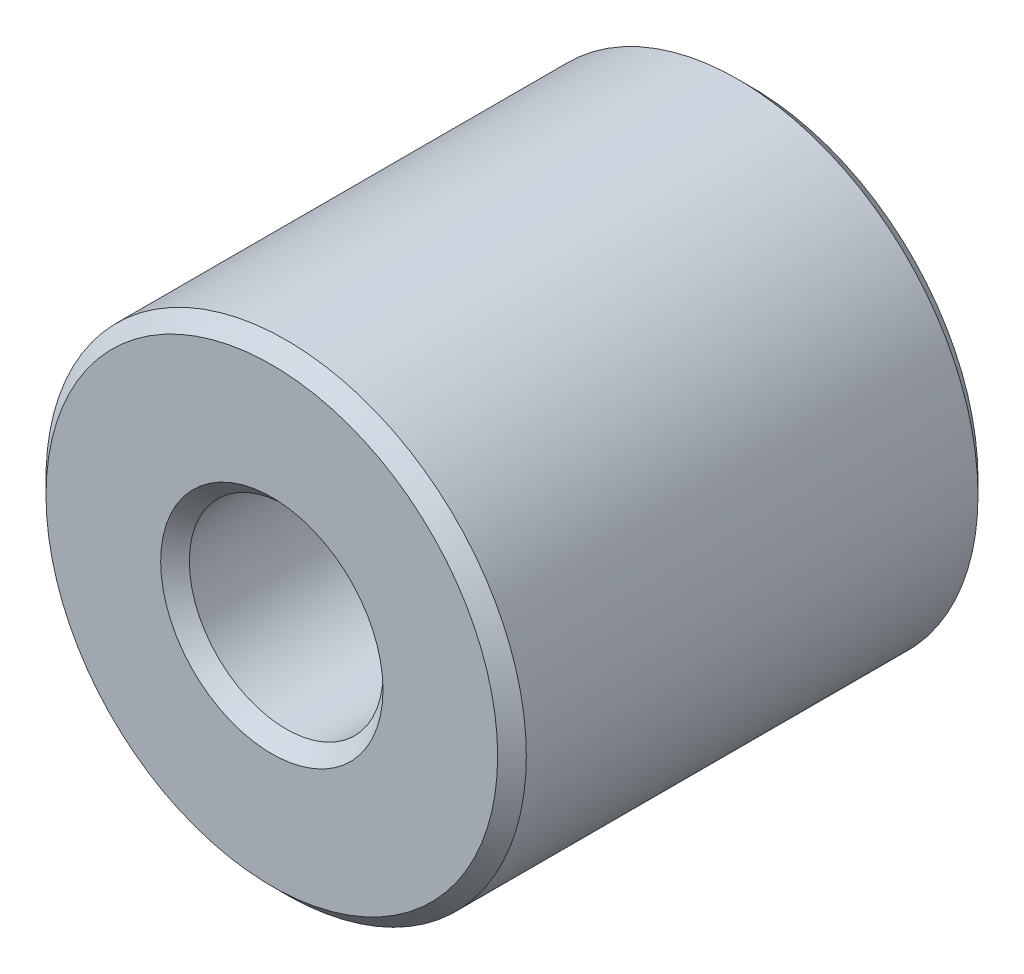
ISO-10303-21;
HEADER;
FILE_DESCRIPTION(('STEP AP214'),'2;1');
FILE_NAME('part.step','',(''),(''),'','','');
FILE_SCHEMA(('AUTOMOTIVE_DESIGN { 1 0 10303 214 1 1 1 1 }'));
ENDSEC;
DATA;
#1=APPLICATION_CONTEXT('core data for automotive mechanical design processes');
#2=APPLICATION_PROTOCOL_DEFINITION('international standard','automotive_design',2000,#1);
#3=PRODUCT_CONTEXT('',#1,'mechanical');
#4=PRODUCT('Part','Part','',(#3));
#5=PRODUCT_RELATED_PRODUCT_CATEGORY('part','',(#4));
#6=PRODUCT_DEFINITION_FORMATION('','',#4);
#7=PRODUCT_DEFINITION_CONTEXT('part definition',#1,'design');
#8=PRODUCT_DEFINITION('design','',#6,#7);
#9=PRODUCT_DEFINITION_SHAPE('','',#8);
#10=(LENGTH_UNIT() NAMED_UNIT(*) SI_UNIT(.MILLI.,.METRE.));
#11=(NAMED_UNIT(*) PLANE_ANGLE_UNIT() SI_UNIT($,.RADIAN.));
#12=(NAMED_UNIT(*) SI_UNIT($,.STERADIAN.) SOLID_ANGLE_UNIT());
#13=UNCERTAINTY_MEASURE_WITH_UNIT(LENGTH_MEASURE(1.E-05),#10,'distance_accuracy_value','');
#14=(GEOMETRIC_REPRESENTATION_CONTEXT(3) GLOBAL_UNCERTAINTY_ASSIGNED_CONTEXT((#13)) GLOBAL_UNIT_ASSIGNED_CONTEXT((#10,
#11,#12)) REPRESENTATION_CONTEXT('',''));
#15=CARTESIAN_POINT('',(0.,0.,0.));
#16=DIRECTION('',(0.,0.,1.));
#17=DIRECTION('',(1.,0.,0.));
#18=AXIS2_PLACEMENT_3D('',#15,#16,#17);
#19=CARTESIAN_POINT('',(0.,0.,-7.9375));
#20=DIRECTION('',(0.,0.,1.));
#21=DIRECTION('',(1.,0.,0.));
#22=AXIS2_PLACEMENT_3D('',#19,#20,#21);
#23=CYLINDRICAL_SURFACE('',#22,7.9375);
#24=CARTESIAN_POINT('',(0.,0.,7.46379));
#25=DIRECTION('',(0.,0.,1.));
#26=DIRECTION('',(1.,0.,0.));
#27=AXIS2_PLACEMENT_3D('',#24,#25,#26);
#28=CIRCLE('',#27,7.9375);
#29=CARTESIAN_POINT('',(7.9375,0.,7.46379));
#30=VERTEX_POINT('',#29);
#31=EDGE_CURVE('E55',#30,#30,#28,.F.);
#32=CARTESIAN_POINT('',(0.,0.,-7.46379));
#33=DIRECTION('',(0.,0.,1.));
#34=DIRECTION('',(1.,0.,0.));
#35=AXIS2_PLACEMENT_3D('',#32,#33,#34);
#36=CIRCLE('',#35,7.9375);
#37=CARTESIAN_POINT('',(7.9375,0.,-7.46379));
#38=VERTEX_POINT('',#37);
#39=EDGE_CURVE('E58',#38,#38,#36,.T.);
#40=CARTESIAN_POINT('',(7.9375,0.,7.46379));
#41=CARTESIAN_POINT('',(7.9375,0.,7.308294375));
#42=CARTESIAN_POINT('',(7.9375,0.,7.15279875));
#43=CARTESIAN_POINT('',(7.9375,0.,6.8418075));
#44=CARTESIAN_POINT('',(7.9375,0.,6.686311875));
#45=CARTESIAN_POINT('',(7.9375,0.,6.375320625));
#46=CARTESIAN_POINT('',(7.9375,0.,6.219825));
#47=CARTESIAN_POINT('',(7.9375,0.,5.90883375));
#48=CARTESIAN_POINT('',(7.9375,0.,5.753338125));
#49=CARTESIAN_POINT('',(7.9375,0.,5.442346875));
#50=CARTESIAN_POINT('',(7.9375,0.,5.28685125));
#51=CARTESIAN_POINT('',(7.9375,0.,4.97586));
#52=CARTESIAN_POINT('',(7.9375,0.,4.820364375));
#53=CARTESIAN_POINT('',(7.9375,0.,4.509373125));
#54=CARTESIAN_POINT('',(7.9375,0.,4.3538775));
#55=CARTESIAN_POINT('',(7.9375,0.,4.04288625));
#56=CARTESIAN_POINT('',(7.9375,0.,3.887390625));
#57=CARTESIAN_POINT('',(7.9375,0.,3.576399375));
#58=CARTESIAN_POINT('',(7.9375,0.,3.42090375));
#59=CARTESIAN_POINT('',(7.9375,0.,3.1099125));
#60=CARTESIAN_POINT('',(7.9375,0.,2.954416875));
#61=CARTESIAN_POINT('',(7.9375,0.,2.643425625));
#62=CARTESIAN_POINT('',(7.9375,0.,2.48793));
#63=CARTESIAN_POINT('',(7.9375,0.,2.17693875));
#64=CARTESIAN_POINT('',(7.9375,0.,2.021443125));
#65=CARTESIAN_POINT('',(7.9375,0.,1.710451875));
#66=CARTESIAN_POINT('',(7.9375,0.,1.55495625));
#67=CARTESIAN_POINT('',(7.9375,0.,1.243965));
#68=CARTESIAN_POINT('',(7.9375,0.,1.088469375));
#69=CARTESIAN_POINT('',(7.9375,0.,0.777478124999996));
#70=CARTESIAN_POINT('',(7.9375,0.,0.621982499999996));
#71=CARTESIAN_POINT('',(7.9375,0.,0.310991249999996));
#72=CARTESIAN_POINT('',(7.9375,0.,0.155495624999996));
#73=CARTESIAN_POINT('',(7.9375,0.,-0.155495625000003));
#74=CARTESIAN_POINT('',(7.9375,0.,-0.310991250000003));
#75=CARTESIAN_POINT('',(7.9375,0.,-0.621982500000003));
#76=CARTESIAN_POINT('',(7.9375,0.,-0.777478125000003));
#77=CARTESIAN_POINT('',(7.9375,0.,-1.088469375));
#78=CARTESIAN_POINT('',(7.9375,0.,-1.243965));
#79=CARTESIAN_POINT('',(7.9375,0.,-1.55495625));
#80=CARTESIAN_POINT('',(7.9375,0.,-1.710451875));
#81=CARTESIAN_POINT('',(7.9375,0.,-2.021443125));
#82=CARTESIAN_POINT('',(7.9375,0.,-2.17693875));
#83=CARTESIAN_POINT('',(7.9375,0.,-2.48793));
#84=CARTESIAN_POINT('',(7.9375,0.,-2.643425625));
#85=CARTESIAN_POINT('',(7.9375,0.,-2.954416875));
#86=CARTESIAN_POINT('',(7.9375,0.,-3.1099125));
#87=CARTESIAN_POINT('',(7.9375,0.,-3.42090375));
#88=CARTESIAN_POINT('',(7.9375,0.,-3.576399375));
#89=CARTESIAN_POINT('',(7.9375,0.,-3.887390625));
#90=CARTESIAN_POINT('',(7.9375,0.,-4.04288625));
#91=CARTESIAN_POINT('',(7.9375,0.,-4.3538775));
#92=CARTESIAN_POINT('',(7.9375,0.,-4.509373125));
#93=CARTESIAN_POINT('',(7.9375,0.,-4.820364375));
#94=CARTESIAN_POINT('',(7.9375,0.,-4.97586));
#95=CARTESIAN_POINT('',(7.9375,0.,-5.28685125));
#96=CARTESIAN_POINT('',(7.9375,0.,-5.442346875));
#97=CARTESIAN_POINT('',(7.9375,0.,-5.75333812500001));
#98=CARTESIAN_POINT('',(7.9375,0.,-5.90883375000001));
#99=CARTESIAN_POINT('',(7.9375,0.,-6.21982500000001));
#100=CARTESIAN_POINT('',(7.9375,0.,-6.375320625));
#101=CARTESIAN_POINT('',(7.9375,0.,-6.686311875));
#102=CARTESIAN_POINT('',(7.9375,0.,-6.84180750000001));
#103=CARTESIAN_POINT('',(7.9375,0.,-7.15279875));
#104=CARTESIAN_POINT('',(7.9375,0.,-7.30829437500001));
#105=CARTESIAN_POINT('',(7.9375,0.,-7.46379));
#106=B_SPLINE_CURVE_WITH_KNOTS('',3,(#40,#41,#42,#43,#44,#45,#46,#47,#48,#49,#50,#51,#52,#53,
#54,#55,#56,#57,#58,#59,#60,#61,#62,#63,#64,#65,#66,#67,#68,#69,#70,#71,#72,#73,#74,#75,#76,#77,
#78,#79,#80,#81,#82,#83,#84,#85,#86,#87,#88,#89,#90,#91,#92,#93,#94,#95,#96,#97,#98,#99,#100,
#101,#102,#103,#104,#105),.UNSPECIFIED.,.F.,.F.,(4,2,2,2,2,2,2,2,2,2,2,2,2,2,2,2,2,2,2,2,2,2,2,
2,2,2,2,2,2,2,2,2,4),(0.,0.466486875,0.93297375,1.399460625,1.8659475,2.332434375,2.79892125,
3.265408125,3.731895,4.198381875,4.66486875,5.131355625,5.5978425,6.064329375,6.53081625,
6.997303125,7.46379,7.930276875,8.39676375,8.863250625,9.3297375,9.796224375,10.26271125,
10.729198125,11.195685,11.662171875,12.12865875,12.595145625,13.0616325,13.528119375,
13.99460625,14.461093125,14.92758),.UNSPECIFIED.);
#107=EDGE_CURVE('BSEAM35',#30,#38,#106,.T.);
#108=ORIENTED_EDGE('',*,*,#31,.T.);
#109=ORIENTED_EDGE('',*,*,#39,.T.);
#110=ORIENTED_EDGE('',*,*,#107,.T.);
#111=ORIENTED_EDGE('',*,*,#107,.F.);
#112=EDGE_LOOP('',(#108,#110,#109,#111));
#113=FACE_BOUND('',#112,.T.);
#114=ADVANCED_FACE('F35',(#113),#23,.T.);
#115=CARTESIAN_POINT('',(0.,0.,-7.9375));
#116=DIRECTION('',(0.,0.,1.));
#117=DIRECTION('',(1.,0.,0.));
#118=AXIS2_PLACEMENT_3D('',#115,#116,#117);
#119=PLANE('',#118);
#120=CARTESIAN_POINT('',(0.,0.,-7.9375));
#121=DIRECTION('',(0.,0.,1.));
#122=DIRECTION('',(1.,0.,0.));
#123=AXIS2_PLACEMENT_3D('',#120,#121,#122);
#124=CIRCLE('',#123,7.46379);
#125=CARTESIAN_POINT('',(7.46379,0.,-7.9375));
#126=VERTEX_POINT('',#125);
#127=EDGE_CURVE('E46',#126,#126,#124,.F.);
#128=ORIENTED_EDGE('',*,*,#127,.T.);
#129=EDGE_LOOP('',(#128));
#130=FACE_BOUND('',#129,.T.);
#131=CARTESIAN_POINT('',(0.,0.,-7.9375));
#132=DIRECTION('',(0.,0.,1.));
#133=DIRECTION('',(1.,0.,0.));
#134=AXIS2_PLACEMENT_3D('',#131,#132,#133);
#135=CIRCLE('',#134,3.67411);
#136=CARTESIAN_POINT('',(3.67411,0.,-7.9375));
#137=VERTEX_POINT('',#136);
#138=EDGE_CURVE('E50',#137,#137,#135,.T.);
#139=ORIENTED_EDGE('',*,*,#138,.T.);
#140=EDGE_LOOP('',(#139));
#141=FACE_BOUND('',#140,.T.);
#142=ADVANCED_FACE('F83',(#130,#141),#119,.F.);
#143=CARTESIAN_POINT('',(0.,0.,-7.9375));
#144=DIRECTION('',(0.,0.,1.));
#145=DIRECTION('',(1.,0.,0.));
#146=AXIS2_PLACEMENT_3D('',#143,#144,#145);
#147=CYLINDRICAL_SURFACE('',#146,3.2004);
#148=CARTESIAN_POINT('',(0.,0.,7.46379000000001));
#149=DIRECTION('',(0.,0.,1.));
#150=DIRECTION('',(1.,0.,0.));
#151=AXIS2_PLACEMENT_3D('',#148,#149,#150);
#152=CIRCLE('',#151,3.2004);
#153=CARTESIAN_POINT('',(3.2004,0.,7.46379000000001));
#154=VERTEX_POINT('',#153);
#155=EDGE_CURVE('E10',#154,#154,#152,.T.);
#156=ORIENTED_EDGE('',*,*,#155,.T.);
#157=EDGE_LOOP('',(#156));
#158=FACE_BOUND('',#157,.T.);
#159=CARTESIAN_POINT('',(0.,0.,-7.46379));
#160=DIRECTION('',(0.,0.,1.));
#161=DIRECTION('',(1.,0.,0.));
#162=AXIS2_PLACEMENT_3D('',#159,#160,#161);
#163=CIRCLE('',#162,3.2004);
#164=CARTESIAN_POINT('',(3.2004,0.,-7.46379));
#165=VERTEX_POINT('',#164);
#166=EDGE_CURVE('E42',#165,#165,#163,.F.);
#167=ORIENTED_EDGE('',*,*,#166,.T.);
#168=EDGE_LOOP('',(#167));
#169=FACE_BOUND('',#168,.T.);
#170=ADVANCED_FACE('F89',(#158,#169),#147,.F.);
#171=CARTESIAN_POINT('',(0.,0.,7.9375));
#172=DIRECTION('',(0.,0.,1.));
#173=DIRECTION('',(1.,0.,0.));
#174=AXIS2_PLACEMENT_3D('',#171,#172,#173);
#175=PLANE('',#174);
#176=CARTESIAN_POINT('',(0.,0.,7.9375));
#177=DIRECTION('',(0.,0.,1.));
#178=DIRECTION('',(1.,0.,0.));
#179=AXIS2_PLACEMENT_3D('',#176,#177,#178);
#180=CIRCLE('',#179,7.46379);
#181=CARTESIAN_POINT('',(7.46379,0.,7.9375));
#182=VERTEX_POINT('',#181);
#183=EDGE_CURVE('E61',#182,#182,#180,.T.);
#184=ORIENTED_EDGE('',*,*,#183,.T.);
#185=EDGE_LOOP('',(#184));
#186=FACE_BOUND('',#185,.T.);
#187=CARTESIAN_POINT('',(0.,0.,7.9375));
#188=DIRECTION('',(0.,0.,1.));
#189=DIRECTION('',(1.,0.,0.));
#190=AXIS2_PLACEMENT_3D('',#187,#188,#189);
#191=CIRCLE('',#190,3.67410999999999);
#192=CARTESIAN_POINT('',(3.67410999999999,0.,7.9375));
#193=VERTEX_POINT('',#192);
#194=EDGE_CURVE('E64',#193,#193,#191,.F.);
#195=ORIENTED_EDGE('',*,*,#194,.T.);
#196=EDGE_LOOP('',(#195));
#197=FACE_BOUND('',#196,.T.);
#198=ADVANCED_FACE('F68',(#186,#197),#175,.T.);
#199=CARTESIAN_POINT('',(0.,0.,7.9375));
#200=DIRECTION('',(0.,0.,-1.));
#201=DIRECTION('',(-1.,0.,0.));
#202=AXIS2_PLACEMENT_3D('',#199,#200,#201);
#203=CONICAL_SURFACE('',#202,7.46379,0.785398163397443);
#204=ORIENTED_EDGE('',*,*,#31,.F.);
#205=EDGE_LOOP('',(#204));
#206=FACE_BOUND('',#205,.T.);
#207=ORIENTED_EDGE('',*,*,#183,.F.);
#208=EDGE_LOOP('',(#207));
#209=FACE_BOUND('',#208,.T.);
#210=ADVANCED_FACE('F79',(#206,#209),#203,.T.);
#211=CARTESIAN_POINT('',(0.,0.,-7.46379));
#212=DIRECTION('',(0.,0.,1.));
#213=DIRECTION('',(1.,0.,0.));
#214=AXIS2_PLACEMENT_3D('',#211,#212,#213);
#215=CONICAL_SURFACE('',#214,7.9375,0.785398163397452);
#216=CARTESIAN_POINT('',(7.46379,0.,-7.9375));
#217=CARTESIAN_POINT('',(7.46872447916667,0.,-7.93256552083334));
#218=CARTESIAN_POINT('',(7.47365895833333,0.,-7.92763104166667));
#219=CARTESIAN_POINT('',(7.48352791666667,0.,-7.91776208333333));
#220=CARTESIAN_POINT('',(7.48846239583333,0.,-7.91282760416667));
#221=CARTESIAN_POINT('',(7.49833135416667,0.,-7.90295864583333));
#222=CARTESIAN_POINT('',(7.50326583333333,0.,-7.89802416666667));
#223=CARTESIAN_POINT('',(7.51313479166667,0.,-7.88815520833334));
#224=CARTESIAN_POINT('',(7.51806927083333,0.,-7.88322072916667));
#225=CARTESIAN_POINT('',(7.52793822916667,0.,-7.87335177083334));
#226=CARTESIAN_POINT('',(7.53287270833333,0.,-7.86841729166667));
#227=CARTESIAN_POINT('',(7.54274166666667,0.,-7.85854833333334));
#228=CARTESIAN_POINT('',(7.54767614583333,0.,-7.85361385416667));
#229=CARTESIAN_POINT('',(7.55754510416667,0.,-7.84374489583334));
#230=CARTESIAN_POINT('',(7.56247958333333,0.,-7.83881041666667));
#231=CARTESIAN_POINT('',(7.57234854166667,0.,-7.82894145833334));
#232=CARTESIAN_POINT('',(7.57728302083333,0.,-7.82400697916667));
#233=CARTESIAN_POINT('',(7.58715197916667,0.,-7.81413802083333));
#234=CARTESIAN_POINT('',(7.59208645833333,0.,-7.80920354166667));
#235=CARTESIAN_POINT('',(7.60195541666667,0.,-7.79933458333334));
#236=CARTESIAN_POINT('',(7.60688989583333,0.,-7.79440010416667));
#237=CARTESIAN_POINT('',(7.61675885416667,0.,-7.78453114583334));
#238=CARTESIAN_POINT('',(7.62169333333333,0.,-7.77959666666667));
#239=CARTESIAN_POINT('',(7.63156229166667,0.,-7.76972770833334));
#240=CARTESIAN_POINT('',(7.63649677083333,0.,-7.76479322916667));
#241=CARTESIAN_POINT('',(7.64636572916667,0.,-7.75492427083334));
#242=CARTESIAN_POINT('',(7.65130020833333,0.,-7.74998979166667));
#243=CARTESIAN_POINT('',(7.66116916666667,0.,-7.74012083333334));
#244=CARTESIAN_POINT('',(7.66610364583333,0.,-7.73518635416667));
#245=CARTESIAN_POINT('',(7.67597260416667,0.,-7.72531739583334));
#246=CARTESIAN_POINT('',(7.68090708333333,0.,-7.72038291666667));
#247=CARTESIAN_POINT('',(7.69077604166667,0.,-7.71051395833334));
#248=CARTESIAN_POINT('',(7.69571052083333,0.,-7.70557947916667));
#249=CARTESIAN_POINT('',(7.70557947916667,0.,-7.69571052083334));
#250=CARTESIAN_POINT('',(7.71051395833333,0.,-7.69077604166667));
#251=CARTESIAN_POINT('',(7.72038291666667,0.,-7.68090708333334));
#252=CARTESIAN_POINT('',(7.72531739583333,0.,-7.67597260416667));
#253=CARTESIAN_POINT('',(7.73518635416667,0.,-7.66610364583334));
#254=CARTESIAN_POINT('',(7.74012083333333,0.,-7.66116916666667));
#255=CARTESIAN_POINT('',(7.74998979166667,0.,-7.65130020833334));
#256=CARTESIAN_POINT('',(7.75492427083333,0.,-7.64636572916667));
#257=CARTESIAN_POINT('',(7.76479322916667,0.,-7.63649677083334));
#258=CARTESIAN_POINT('',(7.76972770833333,0.,-7.63156229166667));
#259=CARTESIAN_POINT('',(7.77959666666667,0.,-7.62169333333334));
#260=CARTESIAN_POINT('',(7.78453114583333,0.,-7.61675885416667));
#261=CARTESIAN_POINT('',(7.79440010416667,0.,-7.60688989583334));
#262=CARTESIAN_POINT('',(7.79933458333333,0.,-7.60195541666667));
#263=CARTESIAN_POINT('',(7.80920354166667,0.,-7.59208645833334));
#264=CARTESIAN_POINT('',(7.81413802083333,0.,-7.58715197916667));
#265=CARTESIAN_POINT('',(7.82400697916667,0.,-7.57728302083334));
#266=CARTESIAN_POINT('',(7.82894145833333,0.,-7.57234854166667));
#267=CARTESIAN_POINT('',(7.83881041666667,0.,-7.56247958333334));
#268=CARTESIAN_POINT('',(7.84374489583333,0.,-7.55754510416667));
#269=CARTESIAN_POINT('',(7.85361385416667,0.,-7.54767614583334));
#270=CARTESIAN_POINT('',(7.85854833333333,0.,-7.54274166666667));
#271=CARTESIAN_POINT('',(7.86841729166667,0.,-7.53287270833334));
#272=CARTESIAN_POINT('',(7.87335177083333,0.,-7.52793822916667));
#273=CARTESIAN_POINT('',(7.88322072916667,0.,-7.51806927083334));
#274=CARTESIAN_POINT('',(7.88815520833333,0.,-7.51313479166667));
#275=CARTESIAN_POINT('',(7.89802416666667,0.,-7.50326583333334));
#276=CARTESIAN_POINT('',(7.90295864583333,0.,-7.49833135416667));
#277=CARTESIAN_POINT('',(7.91282760416667,0.,-7.48846239583334));
#278=CARTESIAN_POINT('',(7.91776208333333,0.,-7.48352791666667));
#279=CARTESIAN_POINT('',(7.92763104166667,0.,-7.47365895833334));
#280=CARTESIAN_POINT('',(7.93256552083333,0.,-7.46872447916667));
#281=CARTESIAN_POINT('',(7.9375,0.,-7.46379));
#282=B_SPLINE_CURVE_WITH_KNOTS('',3,(#216,#217,#218,#219,#220,#221,#222,#223,#224,#225,#226,
#227,#228,#229,#230,#231,#232,#233,#234,#235,#236,#237,#238,#239,#240,#241,#242,#243,#244,#245,
#246,#247,#248,#249,#250,#251,#252,#253,#254,#255,#256,#257,#258,#259,#260,#261,#262,#263,#264,
#265,#266,#267,#268,#269,#270,#271,#272,#273,#274,#275,#276,#277,#278,#279,#280,#281),
.UNSPECIFIED.,.F.,.F.,(4,2,2,2,2,2,2,2,2,2,2,2,2,2,2,2,2,2,2,2,2,2,2,2,2,2,2,2,2,2,2,2,4),(0.,
0.0209352220822426,0.0418704441644857,0.0628056662467271,0.0837408883289696,0.104676110411213,
0.125611332493454,0.146546554575697,0.16748177665794,0.188416998740181,0.209352220822424,
0.230287442904666,0.251222664986909,0.272157887069151,0.293093109151393,0.314028331233636,
0.334963553315878,0.35589877539812,0.376833997480363,0.397769219562605,0.418704441644847,
0.43963966372709,0.460574885809333,0.481510107891574,0.502445329973816,0.52338055205606,
0.544315774138302,0.565250996220543,0.586186218302786,0.607121440385029,0.62805666246727,
0.648991884549513,0.669927106631756),.UNSPECIFIED.);
#283=EDGE_CURVE('BSEAM73',#126,#38,#282,.T.);
#284=ORIENTED_EDGE('',*,*,#127,.F.);
#285=ORIENTED_EDGE('',*,*,#39,.F.);
#286=ORIENTED_EDGE('',*,*,#283,.T.);
#287=ORIENTED_EDGE('',*,*,#283,.F.);
#288=EDGE_LOOP('',(#284,#286,#285,#287));
#289=FACE_BOUND('',#288,.T.);
#290=ADVANCED_FACE('F73',(#289),#215,.T.);
#291=CARTESIAN_POINT('',(0.,0.,7.46379000000001));
#292=DIRECTION('',(0.,0.,1.));
#293=DIRECTION('',(1.,0.,0.));
#294=AXIS2_PLACEMENT_3D('',#291,#292,#293);
#295=CONICAL_SURFACE('',#294,3.2004,0.785398163397451);
#296=CARTESIAN_POINT('',(3.67410999999999,0.,7.9375));
#297=CARTESIAN_POINT('',(3.66917552083333,0.,7.93256552083333));
#298=CARTESIAN_POINT('',(3.66424104166666,0.,7.92763104166667));
#299=CARTESIAN_POINT('',(3.65437208333333,0.,7.91776208333333));
#300=CARTESIAN_POINT('',(3.64943760416666,0.,7.91282760416667));
#301=CARTESIAN_POINT('',(3.63956864583333,0.,7.90295864583333));
#302=CARTESIAN_POINT('',(3.63463416666666,0.,7.89802416666667));
#303=CARTESIAN_POINT('',(3.62476520833333,0.,7.88815520833333));
#304=CARTESIAN_POINT('',(3.61983072916666,0.,7.88322072916667));
#305=CARTESIAN_POINT('',(3.60996177083333,0.,7.87335177083333));
#306=CARTESIAN_POINT('',(3.60502729166666,0.,7.86841729166667));
#307=CARTESIAN_POINT('',(3.59515833333333,0.,7.85854833333334));
#308=CARTESIAN_POINT('',(3.59022385416666,0.,7.85361385416667));
#309=CARTESIAN_POINT('',(3.58035489583333,0.,7.84374489583333));
#310=CARTESIAN_POINT('',(3.57542041666666,0.,7.83881041666667));
#311=CARTESIAN_POINT('',(3.56555145833333,0.,7.82894145833334));
#312=CARTESIAN_POINT('',(3.56061697916666,0.,7.82400697916667));
#313=CARTESIAN_POINT('',(3.55074802083333,0.,7.81413802083333));
#314=CARTESIAN_POINT('',(3.54581354166666,0.,7.80920354166667));
#315=CARTESIAN_POINT('',(3.53594458333333,0.,7.79933458333334));
#316=CARTESIAN_POINT('',(3.53101010416666,0.,7.79440010416667));
#317=CARTESIAN_POINT('',(3.52114114583333,0.,7.78453114583334));
#318=CARTESIAN_POINT('',(3.51620666666666,0.,7.77959666666667));
#319=CARTESIAN_POINT('',(3.50633770833333,0.,7.76972770833334));
#320=CARTESIAN_POINT('',(3.50140322916666,0.,7.76479322916667));
#321=CARTESIAN_POINT('',(3.49153427083333,0.,7.75492427083334));
#322=CARTESIAN_POINT('',(3.48659979166666,0.,7.74998979166667));
#323=CARTESIAN_POINT('',(3.47673083333333,0.,7.74012083333334));
#324=CARTESIAN_POINT('',(3.47179635416666,0.,7.73518635416667));
#325=CARTESIAN_POINT('',(3.46192739583333,0.,7.72531739583334));
#326=CARTESIAN_POINT('',(3.45699291666666,0.,7.72038291666667));
#327=CARTESIAN_POINT('',(3.44712395833333,0.,7.71051395833334));
#328=CARTESIAN_POINT('',(3.44218947916666,0.,7.70557947916667));
#329=CARTESIAN_POINT('',(3.43232052083333,0.,7.69571052083334));
#330=CARTESIAN_POINT('',(3.42738604166666,0.,7.69077604166667));
#331=CARTESIAN_POINT('',(3.41751708333333,0.,7.68090708333334));
#332=CARTESIAN_POINT('',(3.41258260416666,0.,7.67597260416667));
#333=CARTESIAN_POINT('',(3.40271364583333,0.,7.66610364583334));
#334=CARTESIAN_POINT('',(3.39777916666666,0.,7.66116916666667));
#335=CARTESIAN_POINT('',(3.38791020833333,0.,7.65130020833334));
#336=CARTESIAN_POINT('',(3.38297572916666,0.,7.64636572916667));
#337=CARTESIAN_POINT('',(3.37310677083333,0.,7.63649677083334));
#338=CARTESIAN_POINT('',(3.36817229166666,0.,7.63156229166667));
#339=CARTESIAN_POINT('',(3.35830333333333,0.,7.62169333333334));
#340=CARTESIAN_POINT('',(3.35336885416666,0.,7.61675885416667));
#341=CARTESIAN_POINT('',(3.34349989583333,0.,7.60688989583334));
#342=CARTESIAN_POINT('',(3.33856541666666,0.,7.60195541666667));
#343=CARTESIAN_POINT('',(3.32869645833333,0.,7.59208645833334));
#344=CARTESIAN_POINT('',(3.32376197916666,0.,7.58715197916667));
#345=CARTESIAN_POINT('',(3.31389302083333,0.,7.57728302083334));
#346=CARTESIAN_POINT('',(3.30895854166666,0.,7.57234854166667));
#347=CARTESIAN_POINT('',(3.29908958333333,0.,7.56247958333334));
#348=CARTESIAN_POINT('',(3.29415510416667,0.,7.55754510416667));
#349=CARTESIAN_POINT('',(3.28428614583333,0.,7.54767614583334));
#350=CARTESIAN_POINT('',(3.27935166666667,0.,7.54274166666667));
#351=CARTESIAN_POINT('',(3.26948270833333,0.,7.53287270833334));
#352=CARTESIAN_POINT('',(3.26454822916667,0.,7.52793822916667));
#353=CARTESIAN_POINT('',(3.25467927083333,0.,7.51806927083334));
#354=CARTESIAN_POINT('',(3.24974479166667,0.,7.51313479166667));
#355=CARTESIAN_POINT('',(3.23987583333333,0.,7.50326583333334));
#356=CARTESIAN_POINT('',(3.23494135416667,0.,7.49833135416667));
#357=CARTESIAN_POINT('',(3.22507239583333,0.,7.48846239583334));
#358=CARTESIAN_POINT('',(3.22013791666667,0.,7.48352791666667));
#359=CARTESIAN_POINT('',(3.21026895833333,0.,7.47365895833334));
#360=CARTESIAN_POINT('',(3.20533447916667,0.,7.46872447916667));
#361=CARTESIAN_POINT('',(3.2004,0.,7.46379000000001));
#362=B_SPLINE_CURVE_WITH_KNOTS('',3,(#296,#297,#298,#299,#300,#301,#302,#303,#304,#305,#306,
#307,#308,#309,#310,#311,#312,#313,#314,#315,#316,#317,#318,#319,#320,#321,#322,#323,#324,#325,
#326,#327,#328,#329,#330,#331,#332,#333,#334,#335,#336,#337,#338,#339,#340,#341,#342,#343,#344,
#345,#346,#347,#348,#349,#350,#351,#352,#353,#354,#355,#356,#357,#358,#359,#360,#361),
.UNSPECIFIED.,.F.,.F.,(4,2,2,2,2,2,2,2,2,2,2,2,2,2,2,2,2,2,2,2,2,2,2,2,2,2,2,2,2,2,2,2,4),(0.,
0.0209352220822413,0.0418704441644842,0.0628056662467256,0.0837408883289684,0.10467611041121,
0.125611332493452,0.146546554575694,0.167481776657937,0.188416998740179,0.209352220822421,
0.230287442904663,0.251222664986905,0.272157887069148,0.29309310915139,0.314028331233632,
0.334963553315874,0.355898775398116,0.376833997480358,0.3977692195626,0.418704441644842,
0.439639663727084,0.460574885809326,0.481510107891569,0.502445329973811,0.523380552056053,
0.544315774138295,0.565250996220537,0.586186218302779,0.607121440385021,0.628056662467263,
0.648991884549506,0.669927106631748),.UNSPECIFIED.);
#363=EDGE_CURVE('BSEAM70',#193,#154,#362,.T.);
#364=ORIENTED_EDGE('',*,*,#194,.F.);
#365=ORIENTED_EDGE('',*,*,#155,.F.);
#366=ORIENTED_EDGE('',*,*,#363,.T.);
#367=ORIENTED_EDGE('',*,*,#363,.F.);
#368=EDGE_LOOP('',(#364,#366,#365,#367));
#369=FACE_BOUND('',#368,.T.);
#370=ADVANCED_FACE('F70',(#369),#295,.F.);
#371=CARTESIAN_POINT('',(0.,0.,-7.9375));
#372=DIRECTION('',(0.,0.,-1.));
#373=DIRECTION('',(-1.,0.,0.));
#374=AXIS2_PLACEMENT_3D('',#371,#372,#373);
#375=CONICAL_SURFACE('',#374,3.67411,0.785398163397447);
#376=ORIENTED_EDGE('',*,*,#166,.F.);
#377=EDGE_LOOP('',(#376));
#378=FACE_BOUND('',#377,.T.);
#379=ORIENTED_EDGE('',*,*,#138,.F.);
#380=EDGE_LOOP('',(#379));
#381=FACE_BOUND('',#380,.T.);
#382=ADVANCED_FACE('F37',(#378,#381),#375,.F.);
#383=CLOSED_SHELL('',(#114,#142,#170,#198,#210,#290,#370,#382));
#384=MANIFOLD_SOLID_BREP('B2',#383);
#385=ADVANCED_BREP_SHAPE_REPRESENTATION('',(#18,#384),#14);
#386=SHAPE_DEFINITION_REPRESENTATION(#9,#385);
ENDSEC;
END-ISO-10303-21;
